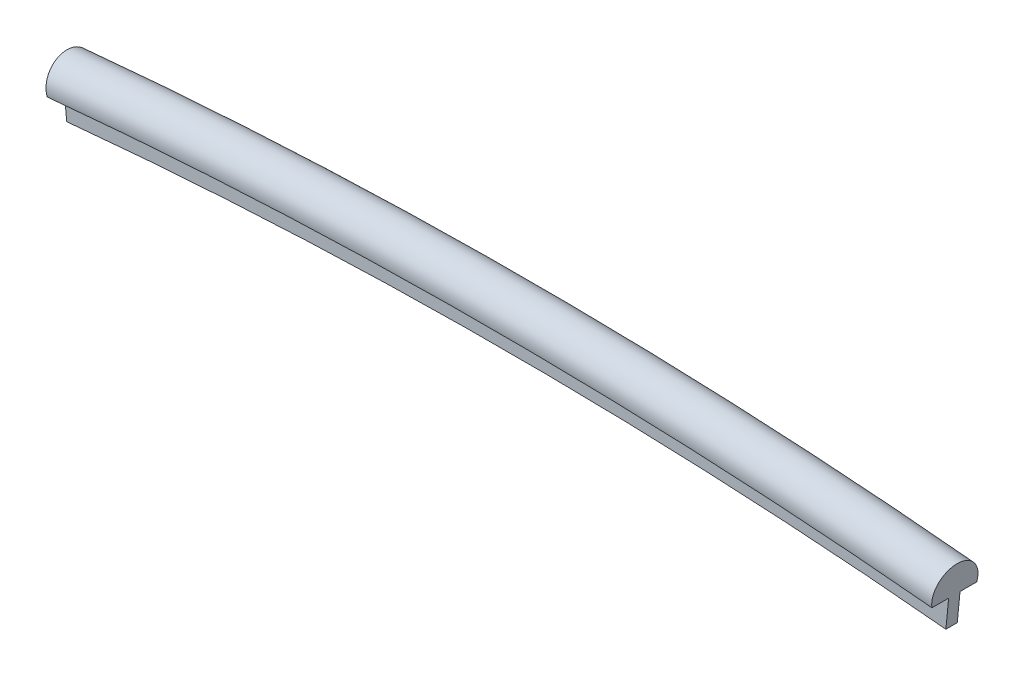
ISO-10303-21;
HEADER;
FILE_DESCRIPTION(('STEP AP214'),'2;1');
FILE_NAME('part.step','',(''),(''),'','','');
FILE_SCHEMA(('AUTOMOTIVE_DESIGN { 1 0 10303 214 1 1 1 1 }'));
ENDSEC;
DATA;
#1=APPLICATION_CONTEXT('core data for automotive mechanical design processes');
#2=APPLICATION_PROTOCOL_DEFINITION('international standard','automotive_design',2000,#1);
#3=PRODUCT_CONTEXT('',#1,'mechanical');
#4=PRODUCT('Part','Part','',(#3));
#5=PRODUCT_RELATED_PRODUCT_CATEGORY('part','',(#4));
#6=PRODUCT_DEFINITION_FORMATION('','',#4);
#7=PRODUCT_DEFINITION_CONTEXT('part definition',#1,'design');
#8=PRODUCT_DEFINITION('design','',#6,#7);
#9=PRODUCT_DEFINITION_SHAPE('','',#8);
#10=(LENGTH_UNIT() NAMED_UNIT(*) SI_UNIT(.MILLI.,.METRE.));
#11=(NAMED_UNIT(*) PLANE_ANGLE_UNIT() SI_UNIT($,.RADIAN.));
#12=(NAMED_UNIT(*) SI_UNIT($,.STERADIAN.) SOLID_ANGLE_UNIT());
#13=UNCERTAINTY_MEASURE_WITH_UNIT(LENGTH_MEASURE(1.E-05),#10,'distance_accuracy_value','');
#14=(GEOMETRIC_REPRESENTATION_CONTEXT(3) GLOBAL_UNCERTAINTY_ASSIGNED_CONTEXT((#13)) GLOBAL_UNIT_ASSIGNED_CONTEXT((#10,
#11,#12)) REPRESENTATION_CONTEXT('',''));
#15=CARTESIAN_POINT('',(0.,0.,0.));
#16=DIRECTION('',(0.,0.,1.));
#17=DIRECTION('',(1.,0.,0.));
#18=AXIS2_PLACEMENT_3D('',#15,#16,#17);
#19=CARTESIAN_POINT('',(0.,0.,70.5976415970385));
#20=DIRECTION('',(0.,0.,1.));
#21=DIRECTION('',(1.,0.,0.));
#22=AXIS2_PLACEMENT_3D('',#19,#20,#21);
#23=CYLINDRICAL_SURFACE('',#22,241.3);
#24=CARTESIAN_POINT('',(0.,0.,1.18));
#25=DIRECTION('',(0.,0.,1.));
#26=DIRECTION('',(1.,0.,0.));
#27=AXIS2_PLACEMENT_3D('',#24,#25,#26);
#28=CIRCLE('',#27,241.3);
#29=CARTESIAN_POINT('',(23.2936887809989,240.17305024289,1.18));
#30=VERTEX_POINT('',#29);
#31=CARTESIAN_POINT('',(-23.2936887809989,240.17305024289,1.18));
#32=VERTEX_POINT('',#31);
#33=EDGE_CURVE('E11',#30,#32,#28,.T.);
#34=ORIENTED_EDGE('',*,*,#33,.T.);
#35=DIRECTION('',(0.,0.,-1.));
#36=VECTOR('',#35,1.);
#37=CARTESIAN_POINT('',(-23.2936887809989,240.17305024289,1.18));
#38=LINE('',#37,#36);
#39=CARTESIAN_POINT('',(-23.2936887809989,240.17305024289,0.3));
#40=VERTEX_POINT('',#39);
#41=EDGE_CURVE('E103',#32,#40,#38,.T.);
#42=ORIENTED_EDGE('',*,*,#41,.T.);
#43=CARTESIAN_POINT('',(0.,0.,0.299999999999995));
#44=DIRECTION('',(0.,0.,1.));
#45=DIRECTION('',(1.,0.,0.));
#46=AXIS2_PLACEMENT_3D('',#43,#44,#45);
#47=CIRCLE('',#46,241.3);
#48=CARTESIAN_POINT('',(23.2936887809989,240.17305024289,0.3));
#49=VERTEX_POINT('',#48);
#50=EDGE_CURVE('E85',#49,#40,#47,.T.);
#51=ORIENTED_EDGE('',*,*,#50,.F.);
#52=DIRECTION('',(0.,0.,-1.));
#53=VECTOR('',#52,1.);
#54=CARTESIAN_POINT('',(23.2936887809989,240.17305024289,1.18));
#55=LINE('',#54,#53);
#56=EDGE_CURVE('E117',#30,#49,#55,.T.);
#57=ORIENTED_EDGE('',*,*,#56,.F.);
#58=EDGE_LOOP('',(#34,#42,#51,#57));
#59=FACE_BOUND('',#58,.T.);
#60=ADVANCED_FACE('F33',(#59),#23,.F.);
#61=CARTESIAN_POINT('',(0.,0.,0.));
#62=DIRECTION('',(0.,0.,1.));
#63=DIRECTION('',(1.,0.,0.));
#64=AXIS2_PLACEMENT_3D('',#61,#62,#63);
#65=TOROIDAL_SURFACE('',#64,241.586013989906,1.21416802890791);
#66=CARTESIAN_POINT('',(0.,0.,-1.18));
#67=DIRECTION('',(0.,0.,1.));
#68=DIRECTION('',(1.,0.,0.));
#69=AXIS2_PLACEMENT_3D('',#66,#67,#68);
#70=CIRCLE('',#69,241.3);
#71=CARTESIAN_POINT('',(23.2936887809989,240.17305024289,-1.18));
#72=VERTEX_POINT('',#71);
#73=CARTESIAN_POINT('',(-23.2936887809989,240.17305024289,-1.18));
#74=VERTEX_POINT('',#73);
#75=EDGE_CURVE('E41',#72,#74,#70,.T.);
#76=ORIENTED_EDGE('',*,*,#75,.T.);
#77=CARTESIAN_POINT('',(-23.3212988964896,240.457728454113,0.));
#78=DIRECTION('',(0.995329673613305,0.0965341433112265,0.));
#79=DIRECTION('',(0.,0.,1.));
#80=AXIS2_PLACEMENT_3D('',#77,#78,#79);
#81=CIRCLE('',#80,1.21416802890791);
#82=EDGE_CURVE('E115',#74,#32,#81,.T.);
#83=ORIENTED_EDGE('',*,*,#82,.T.);
#84=ORIENTED_EDGE('',*,*,#33,.F.);
#85=CARTESIAN_POINT('',(23.3212988964896,240.457728454113,0.));
#86=DIRECTION('',(0.995329673613305,-0.0965341433112265,0.));
#87=DIRECTION('',(0.,0.,1.));
#88=AXIS2_PLACEMENT_3D('',#85,#86,#87);
#89=CIRCLE('',#88,1.21416802890791);
#90=EDGE_CURVE('E97',#72,#30,#89,.T.);
#91=ORIENTED_EDGE('',*,*,#90,.F.);
#92=EDGE_LOOP('',(#76,#83,#84,#91));
#93=FACE_BOUND('',#92,.T.);
#94=ADVANCED_FACE('F35',(#93),#65,.T.);
#95=CARTESIAN_POINT('',(0.,0.,70.5976415970385));
#96=DIRECTION('',(0.,0.,1.));
#97=DIRECTION('',(1.,0.,0.));
#98=AXIS2_PLACEMENT_3D('',#95,#96,#97);
#99=CYLINDRICAL_SURFACE('',#98,241.3);
#100=CARTESIAN_POINT('',(0.,0.,-0.299999999999995));
#101=DIRECTION('',(0.,0.,1.));
#102=DIRECTION('',(1.,0.,0.));
#103=AXIS2_PLACEMENT_3D('',#100,#101,#102);
#104=CIRCLE('',#103,241.3);
#105=CARTESIAN_POINT('',(23.2936887809989,240.17305024289,-0.3));
#106=VERTEX_POINT('',#105);
#107=CARTESIAN_POINT('',(-23.2936887809989,240.17305024289,-0.3));
#108=VERTEX_POINT('',#107);
#109=EDGE_CURVE('E132',#106,#108,#104,.T.);
#110=ORIENTED_EDGE('',*,*,#109,.T.);
#111=DIRECTION('',(0.,0.,-1.));
#112=VECTOR('',#111,1.);
#113=CARTESIAN_POINT('',(-23.2936887809989,240.17305024289,-0.3));
#114=LINE('',#113,#112);
#115=EDGE_CURVE('E113',#108,#74,#114,.T.);
#116=ORIENTED_EDGE('',*,*,#115,.T.);
#117=ORIENTED_EDGE('',*,*,#75,.F.);
#118=DIRECTION('',(0.,0.,-1.));
#119=VECTOR('',#118,1.);
#120=CARTESIAN_POINT('',(23.2936887809989,240.17305024289,-0.3));
#121=LINE('',#120,#119);
#122=EDGE_CURVE('E125',#106,#72,#121,.T.);
#123=ORIENTED_EDGE('',*,*,#122,.F.);
#124=EDGE_LOOP('',(#110,#116,#117,#123));
#125=FACE_BOUND('',#124,.T.);
#126=ADVANCED_FACE('F134',(#125),#99,.F.);
#127=CARTESIAN_POINT('',(23.1488875660321,238.68005573247,-0.3));
#128=DIRECTION('',(0.,0.,1.));
#129=DIRECTION('',(1.,0.,0.));
#130=AXIS2_PLACEMENT_3D('',#127,#128,#129);
#131=PLANE('',#130);
#132=CARTESIAN_POINT('',(0.,0.,-0.299999999999995));
#133=DIRECTION('',(0.,0.,1.));
#134=DIRECTION('',(1.,0.,0.));
#135=AXIS2_PLACEMENT_3D('',#132,#133,#134);
#136=CIRCLE('',#135,239.8);
#137=CARTESIAN_POINT('',(23.1488875660321,238.68005573247,-0.3));
#138=VERTEX_POINT('',#137);
#139=CARTESIAN_POINT('',(-23.1488875660321,238.68005573247,-0.3));
#140=VERTEX_POINT('',#139);
#141=EDGE_CURVE('E129',#138,#140,#136,.T.);
#142=ORIENTED_EDGE('',*,*,#141,.T.);
#143=DIRECTION('',(-0.0965341433112265,0.995329673613305,0.));
#144=VECTOR('',#143,1.);
#145=CARTESIAN_POINT('',(-23.1488875660321,238.68005573247,-0.3));
#146=LINE('',#145,#144);
#147=EDGE_CURVE('E110',#140,#108,#146,.T.);
#148=ORIENTED_EDGE('',*,*,#147,.T.);
#149=ORIENTED_EDGE('',*,*,#109,.F.);
#150=DIRECTION('',(0.0965341433112265,0.995329673613305,0.));
#151=VECTOR('',#150,1.);
#152=CARTESIAN_POINT('',(23.1488875660321,238.68005573247,-0.3));
#153=LINE('',#152,#151);
#154=EDGE_CURVE('E122',#138,#106,#153,.T.);
#155=ORIENTED_EDGE('',*,*,#154,.F.);
#156=EDGE_LOOP('',(#142,#148,#149,#155));
#157=FACE_BOUND('',#156,.T.);
#158=ADVANCED_FACE('F136',(#157),#131,.F.);
#159=CARTESIAN_POINT('',(0.,0.,70.5976415970385));
#160=DIRECTION('',(0.,0.,1.));
#161=DIRECTION('',(1.,0.,0.));
#162=AXIS2_PLACEMENT_3D('',#159,#160,#161);
#163=CYLINDRICAL_SURFACE('',#162,239.8);
#164=CARTESIAN_POINT('',(0.,0.,0.299999999999995));
#165=DIRECTION('',(0.,0.,1.));
#166=DIRECTION('',(1.,0.,0.));
#167=AXIS2_PLACEMENT_3D('',#164,#165,#166);
#168=CIRCLE('',#167,239.8);
#169=CARTESIAN_POINT('',(23.1488875660321,238.68005573247,0.3));
#170=VERTEX_POINT('',#169);
#171=CARTESIAN_POINT('',(-23.1488875660321,238.68005573247,0.3));
#172=VERTEX_POINT('',#171);
#173=EDGE_CURVE('E96',#170,#172,#168,.T.);
#174=ORIENTED_EDGE('',*,*,#173,.T.);
#175=DIRECTION('',(0.,0.,-1.));
#176=VECTOR('',#175,1.);
#177=CARTESIAN_POINT('',(-23.1488875660321,238.68005573247,0.));
#178=LINE('',#177,#176);
#179=EDGE_CURVE('E105',#172,#140,#178,.T.);
#180=ORIENTED_EDGE('',*,*,#179,.T.);
#181=ORIENTED_EDGE('',*,*,#141,.F.);
#182=DIRECTION('',(0.,0.,-1.));
#183=VECTOR('',#182,1.);
#184=CARTESIAN_POINT('',(23.1488875660321,238.68005573247,0.));
#185=LINE('',#184,#183);
#186=EDGE_CURVE('E120',#170,#138,#185,.T.);
#187=ORIENTED_EDGE('',*,*,#186,.F.);
#188=EDGE_LOOP('',(#174,#180,#181,#187));
#189=FACE_BOUND('',#188,.T.);
#190=ADVANCED_FACE('F141',(#189),#163,.F.);
#191=CARTESIAN_POINT('',(23.1488875660321,238.68005573247,0.3));
#192=DIRECTION('',(0.,0.,-1.));
#193=DIRECTION('',(-1.,0.,0.));
#194=AXIS2_PLACEMENT_3D('',#191,#192,#193);
#195=PLANE('',#194);
#196=DIRECTION('',(-0.0965341433112265,-0.995329673613305,0.));
#197=VECTOR('',#196,1.);
#198=CARTESIAN_POINT('',(23.1488875660321,238.68005573247,0.3));
#199=LINE('',#198,#197);
#200=EDGE_CURVE('E91',#49,#170,#199,.T.);
#201=ORIENTED_EDGE('',*,*,#200,.F.);
#202=ORIENTED_EDGE('',*,*,#50,.T.);
#203=DIRECTION('',(0.0965341433112265,-0.995329673613305,0.));
#204=VECTOR('',#203,1.);
#205=CARTESIAN_POINT('',(-23.1488875660321,238.68005573247,0.3));
#206=LINE('',#205,#204);
#207=EDGE_CURVE('E88',#40,#172,#206,.T.);
#208=ORIENTED_EDGE('',*,*,#207,.T.);
#209=ORIENTED_EDGE('',*,*,#173,.F.);
#210=EDGE_LOOP('',(#201,#202,#208,#209));
#211=FACE_BOUND('',#210,.T.);
#212=ADVANCED_FACE('F87',(#211),#195,.F.);
#213=CARTESIAN_POINT('',(23.3212988964896,240.457728454113,0.));
#214=DIRECTION('',(-0.995329673613305,0.0965341433112265,0.));
#215=DIRECTION('',(0.,0.,1.));
#216=AXIS2_PLACEMENT_3D('',#213,#214,#215);
#217=PLANE('',#216);
#218=ORIENTED_EDGE('',*,*,#56,.T.);
#219=ORIENTED_EDGE('',*,*,#200,.T.);
#220=ORIENTED_EDGE('',*,*,#186,.T.);
#221=ORIENTED_EDGE('',*,*,#154,.T.);
#222=ORIENTED_EDGE('',*,*,#122,.T.);
#223=ORIENTED_EDGE('',*,*,#90,.T.);
#224=EDGE_LOOP('',(#218,#219,#220,#221,#222,#223));
#225=FACE_BOUND('',#224,.T.);
#226=ADVANCED_FACE('F143',(#225),#217,.F.);
#227=CARTESIAN_POINT('',(-23.3212988964896,240.457728454113,0.));
#228=DIRECTION('',(-0.995329673613305,-0.0965341433112265,0.));
#229=DIRECTION('',(0.,0.,1.));
#230=AXIS2_PLACEMENT_3D('',#227,#228,#229);
#231=PLANE('',#230);
#232=ORIENTED_EDGE('',*,*,#41,.F.);
#233=ORIENTED_EDGE('',*,*,#82,.F.);
#234=ORIENTED_EDGE('',*,*,#115,.F.);
#235=ORIENTED_EDGE('',*,*,#147,.F.);
#236=ORIENTED_EDGE('',*,*,#179,.F.);
#237=ORIENTED_EDGE('',*,*,#207,.F.);
#238=EDGE_LOOP('',(#232,#233,#234,#235,#236,#237));
#239=FACE_BOUND('',#238,.T.);
#240=ADVANCED_FACE('F101',(#239),#231,.T.);
#241=CLOSED_SHELL('',(#60,#94,#126,#158,#190,#212,#226,#240));
#242=MANIFOLD_SOLID_BREP('B2',#241);
#243=ADVANCED_BREP_SHAPE_REPRESENTATION('',(#18,#242),#14);
#244=SHAPE_DEFINITION_REPRESENTATION(#9,#243);
ENDSEC;
END-ISO-10303-21;
